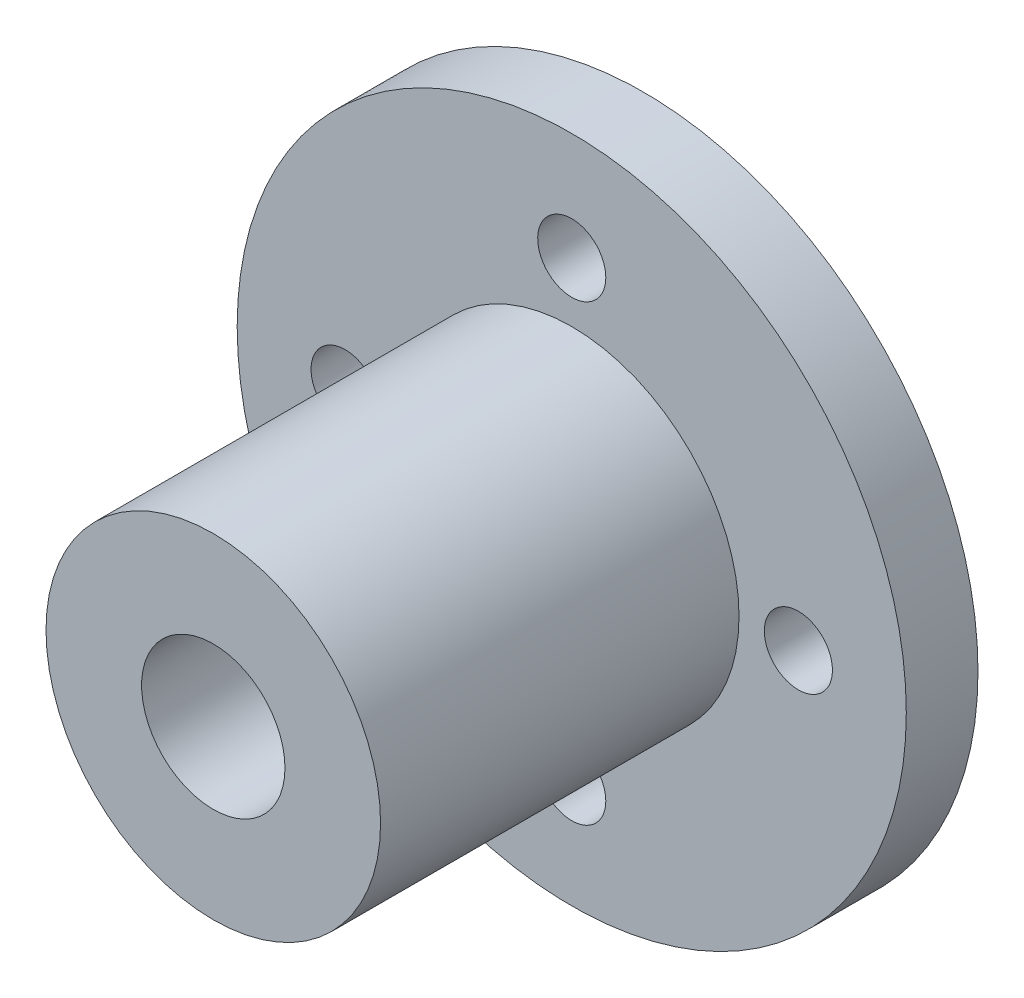
ISO-10303-21;
HEADER;
FILE_DESCRIPTION(('STEP AP214'),'2;1');
FILE_NAME('part.step','',(''),(''),'','','');
FILE_SCHEMA(('AUTOMOTIVE_DESIGN { 1 0 10303 214 1 1 1 1 }'));
ENDSEC;
DATA;
#1=APPLICATION_CONTEXT('core data for automotive mechanical design processes');
#2=APPLICATION_PROTOCOL_DEFINITION('international standard','automotive_design',2000,#1);
#3=PRODUCT_CONTEXT('',#1,'mechanical');
#4=PRODUCT('Part','Part','',(#3));
#5=PRODUCT_RELATED_PRODUCT_CATEGORY('part','',(#4));
#6=PRODUCT_DEFINITION_FORMATION('','',#4);
#7=PRODUCT_DEFINITION_CONTEXT('part definition',#1,'design');
#8=PRODUCT_DEFINITION('design','',#6,#7);
#9=PRODUCT_DEFINITION_SHAPE('','',#8);
#10=(LENGTH_UNIT() NAMED_UNIT(*) SI_UNIT(.MILLI.,.METRE.));
#11=(NAMED_UNIT(*) PLANE_ANGLE_UNIT() SI_UNIT($,.RADIAN.));
#12=(NAMED_UNIT(*) SI_UNIT($,.STERADIAN.) SOLID_ANGLE_UNIT());
#13=UNCERTAINTY_MEASURE_WITH_UNIT(LENGTH_MEASURE(1.E-05),#10,'distance_accuracy_value','');
#14=(GEOMETRIC_REPRESENTATION_CONTEXT(3) GLOBAL_UNCERTAINTY_ASSIGNED_CONTEXT((#13)) GLOBAL_UNIT_ASSIGNED_CONTEXT((#10,
#11,#12)) REPRESENTATION_CONTEXT('',''));
#15=CARTESIAN_POINT('',(0.,0.,0.));
#16=DIRECTION('',(0.,0.,1.));
#17=DIRECTION('',(1.,0.,0.));
#18=AXIS2_PLACEMENT_3D('',#15,#16,#17);
#19=CARTESIAN_POINT('',(-21.4160518527565,15.9178410794603,3.));
#20=DIRECTION('',(0.,0.,-1.));
#21=DIRECTION('',(-1.,0.,0.));
#22=AXIS2_PLACEMENT_3D('',#19,#20,#21);
#23=CYLINDRICAL_SURFACE('',#22,14.);
#24=CARTESIAN_POINT('',(-21.4160518527565,15.9178410794603,3.));
#25=DIRECTION('',(0.,0.,1.));
#26=DIRECTION('',(1.,0.,0.));
#27=AXIS2_PLACEMENT_3D('',#24,#25,#26);
#28=CIRCLE('',#27,14.);
#29=CARTESIAN_POINT('',(-7.41605185275647,15.9178410794603,3.));
#30=VERTEX_POINT('',#29);
#31=EDGE_CURVE('E38',#30,#30,#28,.T.);
#32=ORIENTED_EDGE('',*,*,#31,.F.);
#33=EDGE_LOOP('',(#32));
#34=FACE_BOUND('',#33,.T.);
#35=CARTESIAN_POINT('',(-21.4160518527565,15.9178410794603,0.));
#36=DIRECTION('',(0.,0.,1.));
#37=DIRECTION('',(1.,0.,0.));
#38=AXIS2_PLACEMENT_3D('',#35,#36,#37);
#39=CIRCLE('',#38,14.);
#40=CARTESIAN_POINT('',(-7.41605185275647,15.9178410794603,0.));
#41=VERTEX_POINT('',#40);
#42=EDGE_CURVE('E43',#41,#41,#39,.T.);
#43=ORIENTED_EDGE('',*,*,#42,.T.);
#44=EDGE_LOOP('',(#43));
#45=FACE_BOUND('',#44,.T.);
#46=ADVANCED_FACE('F31',(#34,#45),#23,.T.);
#47=CARTESIAN_POINT('',(-21.4160518527565,15.9178410794603,3.));
#48=DIRECTION('',(0.,0.,1.));
#49=DIRECTION('',(1.,0.,0.));
#50=AXIS2_PLACEMENT_3D('',#47,#48,#49);
#51=PLANE('',#50);
#52=CARTESIAN_POINT('',(-21.4160518527564,6.43387420751295,3.));
#53=DIRECTION('',(0.,0.,1.));
#54=DIRECTION('',(0.,1.,0.));
#55=AXIS2_PLACEMENT_3D('',#52,#53,#54);
#56=CIRCLE('',#55,1.425);
#57=CARTESIAN_POINT('',(-21.4160518527564,7.85887420751295,3.));
#58=VERTEX_POINT('',#57);
#59=EDGE_CURVE('E59',#58,#58,#56,.T.);
#60=ORIENTED_EDGE('',*,*,#59,.F.);
#61=EDGE_LOOP('',(#60));
#62=FACE_BOUND('',#61,.T.);
#63=CARTESIAN_POINT('',(-11.9320849808091,15.9178410794603,3.));
#64=DIRECTION('',(0.,0.,1.));
#65=DIRECTION('',(-1.,0.,0.));
#66=AXIS2_PLACEMENT_3D('',#63,#64,#65);
#67=CIRCLE('',#66,1.425);
#68=CARTESIAN_POINT('',(-13.3570849808091,15.9178410794603,3.));
#69=VERTEX_POINT('',#68);
#70=EDGE_CURVE('E116',#69,#69,#67,.T.);
#71=ORIENTED_EDGE('',*,*,#70,.F.);
#72=EDGE_LOOP('',(#71));
#73=FACE_BOUND('',#72,.T.);
#74=CARTESIAN_POINT('',(-21.4160518527566,25.4018079514076,3.));
#75=DIRECTION('',(0.,0.,1.));
#76=DIRECTION('',(0.,-1.,0.));
#77=AXIS2_PLACEMENT_3D('',#74,#75,#76);
#78=CIRCLE('',#77,1.425);
#79=CARTESIAN_POINT('',(-21.4160518527566,23.9768079514076,3.));
#80=VERTEX_POINT('',#79);
#81=EDGE_CURVE('E72',#80,#80,#78,.T.);
#82=ORIENTED_EDGE('',*,*,#81,.F.);
#83=EDGE_LOOP('',(#82));
#84=FACE_BOUND('',#83,.T.);
#85=CARTESIAN_POINT('',(-30.9000187247038,15.9178410794603,3.));
#86=DIRECTION('',(0.,0.,1.));
#87=DIRECTION('',(1.,0.,0.));
#88=AXIS2_PLACEMENT_3D('',#85,#86,#87);
#89=CIRCLE('',#88,1.425);
#90=CARTESIAN_POINT('',(-29.4750187247038,15.9178410794603,3.));
#91=VERTEX_POINT('',#90);
#92=EDGE_CURVE('E55',#91,#91,#89,.T.);
#93=ORIENTED_EDGE('',*,*,#92,.F.);
#94=EDGE_LOOP('',(#93));
#95=FACE_BOUND('',#94,.T.);
#96=CARTESIAN_POINT('',(-21.4160518527565,15.9178410794603,3.));
#97=DIRECTION('',(0.,0.,1.));
#98=DIRECTION('',(1.,0.,0.));
#99=AXIS2_PLACEMENT_3D('',#96,#97,#98);
#100=CIRCLE('',#99,7.);
#101=CARTESIAN_POINT('',(-14.4160518527565,15.9178410794603,3.));
#102=VERTEX_POINT('',#101);
#103=EDGE_CURVE('E10',#102,#102,#100,.T.);
#104=ORIENTED_EDGE('',*,*,#103,.F.);
#105=EDGE_LOOP('',(#104));
#106=FACE_BOUND('',#105,.T.);
#107=ORIENTED_EDGE('',*,*,#31,.T.);
#108=EDGE_LOOP('',(#107));
#109=FACE_BOUND('',#108,.T.);
#110=ADVANCED_FACE('F95',(#62,#73,#84,#95,#106,#109),#51,.T.);
#111=CARTESIAN_POINT('',(-21.4160518527565,15.9178410794603,0.));
#112=DIRECTION('',(0.,0.,1.));
#113=DIRECTION('',(1.,0.,0.));
#114=AXIS2_PLACEMENT_3D('',#111,#112,#113);
#115=PLANE('',#114);
#116=CARTESIAN_POINT('',(-21.4160518527564,6.43387420751295,0.));
#117=DIRECTION('',(0.,0.,1.));
#118=DIRECTION('',(1.,0.,0.));
#119=AXIS2_PLACEMENT_3D('',#116,#117,#118);
#120=CIRCLE('',#119,1.425);
#121=CARTESIAN_POINT('',(-19.9910518527564,6.43387420751295,0.));
#122=VERTEX_POINT('',#121);
#123=EDGE_CURVE('E34',#122,#122,#120,.T.);
#124=ORIENTED_EDGE('',*,*,#123,.T.);
#125=EDGE_LOOP('',(#124));
#126=FACE_BOUND('',#125,.T.);
#127=CARTESIAN_POINT('',(-11.9320849808091,15.9178410794603,0.));
#128=DIRECTION('',(0.,0.,1.));
#129=DIRECTION('',(1.,0.,0.));
#130=AXIS2_PLACEMENT_3D('',#127,#128,#129);
#131=CIRCLE('',#130,1.425);
#132=CARTESIAN_POINT('',(-10.5070849808091,15.9178410794603,0.));
#133=VERTEX_POINT('',#132);
#134=EDGE_CURVE('E58',#133,#133,#131,.T.);
#135=ORIENTED_EDGE('',*,*,#134,.T.);
#136=EDGE_LOOP('',(#135));
#137=FACE_BOUND('',#136,.T.);
#138=CARTESIAN_POINT('',(-21.4160518527566,25.4018079514076,0.));
#139=DIRECTION('',(0.,0.,1.));
#140=DIRECTION('',(1.,0.,0.));
#141=AXIS2_PLACEMENT_3D('',#138,#139,#140);
#142=CIRCLE('',#141,1.425);
#143=CARTESIAN_POINT('',(-19.9910518527566,25.4018079514076,0.));
#144=VERTEX_POINT('',#143);
#145=EDGE_CURVE('E56',#144,#144,#142,.T.);
#146=ORIENTED_EDGE('',*,*,#145,.T.);
#147=EDGE_LOOP('',(#146));
#148=FACE_BOUND('',#147,.T.);
#149=CARTESIAN_POINT('',(-30.9000187247038,15.9178410794603,0.));
#150=DIRECTION('',(0.,0.,1.));
#151=DIRECTION('',(1.,0.,0.));
#152=AXIS2_PLACEMENT_3D('',#149,#150,#151);
#153=CIRCLE('',#152,1.425);
#154=CARTESIAN_POINT('',(-29.4750187247038,15.9178410794603,0.));
#155=VERTEX_POINT('',#154);
#156=EDGE_CURVE('E51',#155,#155,#153,.T.);
#157=ORIENTED_EDGE('',*,*,#156,.T.);
#158=EDGE_LOOP('',(#157));
#159=FACE_BOUND('',#158,.T.);
#160=CARTESIAN_POINT('',(-21.4160518527565,15.9178410794603,0.));
#161=DIRECTION('',(0.,0.,1.));
#162=DIRECTION('',(1.,0.,0.));
#163=AXIS2_PLACEMENT_3D('',#160,#161,#162);
#164=CIRCLE('',#163,3.);
#165=CARTESIAN_POINT('',(-18.4160518527565,15.9178410794603,0.));
#166=VERTEX_POINT('',#165);
#167=EDGE_CURVE('E74',#166,#166,#164,.T.);
#168=ORIENTED_EDGE('',*,*,#167,.T.);
#169=EDGE_LOOP('',(#168));
#170=FACE_BOUND('',#169,.T.);
#171=ORIENTED_EDGE('',*,*,#42,.F.);
#172=EDGE_LOOP('',(#171));
#173=FACE_BOUND('',#172,.T.);
#174=ADVANCED_FACE('F90',(#126,#137,#148,#159,#170,#173),#115,.F.);
#175=CARTESIAN_POINT('',(-21.4160518527565,15.9178410794603,18.));
#176=DIRECTION('',(0.,0.,-1.));
#177=DIRECTION('',(-1.,0.,0.));
#178=AXIS2_PLACEMENT_3D('',#175,#176,#177);
#179=CYLINDRICAL_SURFACE('',#178,7.);
#180=CARTESIAN_POINT('',(-21.4160518527565,15.9178410794603,18.));
#181=DIRECTION('',(0.,0.,1.));
#182=DIRECTION('',(1.,0.,0.));
#183=AXIS2_PLACEMENT_3D('',#180,#181,#182);
#184=CIRCLE('',#183,7.);
#185=CARTESIAN_POINT('',(-14.4160518527565,15.9178410794603,18.));
#186=VERTEX_POINT('',#185);
#187=EDGE_CURVE('E46',#186,#186,#184,.T.);
#188=ORIENTED_EDGE('',*,*,#187,.F.);
#189=EDGE_LOOP('',(#188));
#190=FACE_BOUND('',#189,.T.);
#191=ORIENTED_EDGE('',*,*,#103,.T.);
#192=EDGE_LOOP('',(#191));
#193=FACE_BOUND('',#192,.T.);
#194=ADVANCED_FACE('F84',(#190,#193),#179,.T.);
#195=CARTESIAN_POINT('',(-21.4160518527565,15.9178410794603,18.));
#196=DIRECTION('',(0.,0.,1.));
#197=DIRECTION('',(1.,0.,0.));
#198=AXIS2_PLACEMENT_3D('',#195,#196,#197);
#199=PLANE('',#198);
#200=CARTESIAN_POINT('',(-21.4160518527565,15.9178410794603,18.));
#201=DIRECTION('',(0.,0.,1.));
#202=DIRECTION('',(1.,0.,0.));
#203=AXIS2_PLACEMENT_3D('',#200,#201,#202);
#204=CIRCLE('',#203,3.);
#205=CARTESIAN_POINT('',(-18.4160518527565,15.9178410794603,18.));
#206=VERTEX_POINT('',#205);
#207=EDGE_CURVE('E54',#206,#206,#204,.T.);
#208=ORIENTED_EDGE('',*,*,#207,.F.);
#209=EDGE_LOOP('',(#208));
#210=FACE_BOUND('',#209,.T.);
#211=ORIENTED_EDGE('',*,*,#187,.T.);
#212=EDGE_LOOP('',(#211));
#213=FACE_BOUND('',#212,.T.);
#214=ADVANCED_FACE('F81',(#210,#213),#199,.T.);
#215=CARTESIAN_POINT('',(-21.4160518527565,15.9178410794603,0.));
#216=DIRECTION('',(0.,0.,1.));
#217=DIRECTION('',(1.,0.,0.));
#218=AXIS2_PLACEMENT_3D('',#215,#216,#217);
#219=CYLINDRICAL_SURFACE('',#218,3.);
#220=ORIENTED_EDGE('',*,*,#167,.F.);
#221=EDGE_LOOP('',(#220));
#222=FACE_BOUND('',#221,.T.);
#223=ORIENTED_EDGE('',*,*,#207,.T.);
#224=EDGE_LOOP('',(#223));
#225=FACE_BOUND('',#224,.T.);
#226=ADVANCED_FACE('F79',(#222,#225),#219,.F.);
#227=CARTESIAN_POINT('',(-30.9000187247038,15.9178410794603,-15.));
#228=DIRECTION('',(0.,0.,1.));
#229=DIRECTION('',(1.,0.,0.));
#230=AXIS2_PLACEMENT_3D('',#227,#228,#229);
#231=CYLINDRICAL_SURFACE('',#230,1.425);
#232=ORIENTED_EDGE('',*,*,#92,.T.);
#233=EDGE_LOOP('',(#232));
#234=FACE_BOUND('',#233,.T.);
#235=ORIENTED_EDGE('',*,*,#156,.F.);
#236=EDGE_LOOP('',(#235));
#237=FACE_BOUND('',#236,.T.);
#238=ADVANCED_FACE('F138',(#234,#237),#231,.F.);
#239=CARTESIAN_POINT('',(-21.4160518527566,25.4018079514076,-15.));
#240=DIRECTION('',(0.,0.,1.));
#241=DIRECTION('',(1.,0.,0.));
#242=AXIS2_PLACEMENT_3D('',#239,#240,#241);
#243=CYLINDRICAL_SURFACE('',#242,1.425);
#244=ORIENTED_EDGE('',*,*,#81,.T.);
#245=EDGE_LOOP('',(#244));
#246=FACE_BOUND('',#245,.T.);
#247=ORIENTED_EDGE('',*,*,#145,.F.);
#248=EDGE_LOOP('',(#247));
#249=FACE_BOUND('',#248,.T.);
#250=ADVANCED_FACE('F133',(#246,#249),#243,.F.);
#251=CARTESIAN_POINT('',(-11.9320849808091,15.9178410794603,-15.));
#252=DIRECTION('',(0.,0.,1.));
#253=DIRECTION('',(1.,0.,0.));
#254=AXIS2_PLACEMENT_3D('',#251,#252,#253);
#255=CYLINDRICAL_SURFACE('',#254,1.425);
#256=ORIENTED_EDGE('',*,*,#70,.T.);
#257=EDGE_LOOP('',(#256));
#258=FACE_BOUND('',#257,.T.);
#259=ORIENTED_EDGE('',*,*,#134,.F.);
#260=EDGE_LOOP('',(#259));
#261=FACE_BOUND('',#260,.T.);
#262=ADVANCED_FACE('F128',(#258,#261),#255,.F.);
#263=CARTESIAN_POINT('',(-21.4160518527564,6.43387420751295,-15.));
#264=DIRECTION('',(0.,0.,1.));
#265=DIRECTION('',(1.,0.,0.));
#266=AXIS2_PLACEMENT_3D('',#263,#264,#265);
#267=CYLINDRICAL_SURFACE('',#266,1.425);
#268=ORIENTED_EDGE('',*,*,#59,.T.);
#269=EDGE_LOOP('',(#268));
#270=FACE_BOUND('',#269,.T.);
#271=ORIENTED_EDGE('',*,*,#123,.F.);
#272=EDGE_LOOP('',(#271));
#273=FACE_BOUND('',#272,.T.);
#274=ADVANCED_FACE('F125',(#270,#273),#267,.F.);
#275=CLOSED_SHELL('',(#46,#110,#174,#194,#214,#226,#238,#250,#262,#274));
#276=MANIFOLD_SOLID_BREP('B2',#275);
#277=ADVANCED_BREP_SHAPE_REPRESENTATION('',(#18,#276),#14);
#278=SHAPE_DEFINITION_REPRESENTATION(#9,#277);
ENDSEC;
END-ISO-10303-21;
